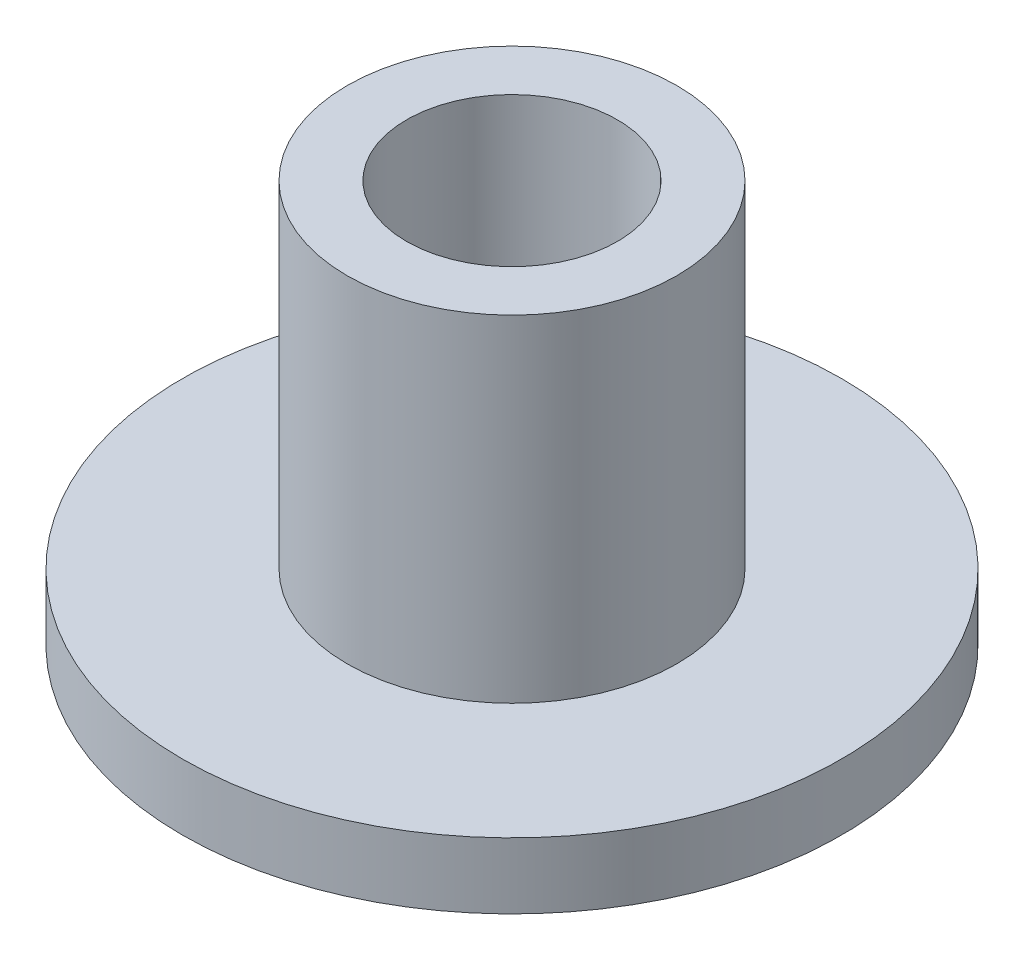
ISO-10303-21;
HEADER;
FILE_DESCRIPTION(('STEP AP214'),'2;1');
FILE_NAME('part.step','',(''),(''),'','','');
FILE_SCHEMA(('AUTOMOTIVE_DESIGN { 1 0 10303 214 1 1 1 1 }'));
ENDSEC;
DATA;
#1=APPLICATION_CONTEXT('core data for automotive mechanical design processes');
#2=APPLICATION_PROTOCOL_DEFINITION('international standard','automotive_design',2000,#1);
#3=PRODUCT_CONTEXT('',#1,'mechanical');
#4=PRODUCT('Part','Part','',(#3));
#5=PRODUCT_RELATED_PRODUCT_CATEGORY('part','',(#4));
#6=PRODUCT_DEFINITION_FORMATION('','',#4);
#7=PRODUCT_DEFINITION_CONTEXT('part definition',#1,'design');
#8=PRODUCT_DEFINITION('design','',#6,#7);
#9=PRODUCT_DEFINITION_SHAPE('','',#8);
#10=(LENGTH_UNIT() NAMED_UNIT(*) SI_UNIT(.MILLI.,.METRE.));
#11=(NAMED_UNIT(*) PLANE_ANGLE_UNIT() SI_UNIT($,.RADIAN.));
#12=(NAMED_UNIT(*) SI_UNIT($,.STERADIAN.) SOLID_ANGLE_UNIT());
#13=UNCERTAINTY_MEASURE_WITH_UNIT(LENGTH_MEASURE(1.E-05),#10,'distance_accuracy_value','');
#14=(GEOMETRIC_REPRESENTATION_CONTEXT(3) GLOBAL_UNCERTAINTY_ASSIGNED_CONTEXT((#13)) GLOBAL_UNIT_ASSIGNED_CONTEXT((#10,
#11,#12)) REPRESENTATION_CONTEXT('',''));
#15=CARTESIAN_POINT('',(0.,0.,0.));
#16=DIRECTION('',(0.,0.,1.));
#17=DIRECTION('',(1.,0.,0.));
#18=AXIS2_PLACEMENT_3D('',#15,#16,#17);
#19=CARTESIAN_POINT('',(0.,6.1,0.));
#20=DIRECTION('',(0.,-1.,0.));
#21=DIRECTION('',(0.,0.,-1.));
#22=AXIS2_PLACEMENT_3D('',#19,#20,#21);
#23=CYLINDRICAL_SURFACE('',#22,5.);
#24=CARTESIAN_POINT('',(0.,0.,0.));
#25=DIRECTION('',(0.,1.,0.));
#26=DIRECTION('',(0.,0.,1.));
#27=AXIS2_PLACEMENT_3D('',#24,#25,#26);
#28=CIRCLE('',#27,5.);
#29=CARTESIAN_POINT('',(0.,0.,5.));
#30=VERTEX_POINT('',#29);
#31=EDGE_CURVE('E10',#30,#30,#28,.T.);
#32=ORIENTED_EDGE('',*,*,#31,.T.);
#33=EDGE_LOOP('',(#32));
#34=FACE_BOUND('',#33,.T.);
#35=CARTESIAN_POINT('',(0.,1.,0.));
#36=DIRECTION('',(0.,1.,0.));
#37=DIRECTION('',(0.,0.,1.));
#38=AXIS2_PLACEMENT_3D('',#35,#36,#37);
#39=CIRCLE('',#38,5.);
#40=CARTESIAN_POINT('',(0.,1.,5.));
#41=VERTEX_POINT('',#40);
#42=EDGE_CURVE('E33',#41,#41,#39,.T.);
#43=ORIENTED_EDGE('',*,*,#42,.F.);
#44=EDGE_LOOP('',(#43));
#45=FACE_BOUND('',#44,.T.);
#46=ADVANCED_FACE('F30',(#34,#45),#23,.T.);
#47=CARTESIAN_POINT('',(0.,6.1,0.));
#48=DIRECTION('',(0.,1.,0.));
#49=DIRECTION('',(0.,0.,1.));
#50=AXIS2_PLACEMENT_3D('',#47,#48,#49);
#51=PLANE('',#50);
#52=CARTESIAN_POINT('',(0.,6.1,0.));
#53=DIRECTION('',(0.,1.,0.));
#54=DIRECTION('',(0.,0.,1.));
#55=AXIS2_PLACEMENT_3D('',#52,#53,#54);
#56=CIRCLE('',#55,1.6);
#57=CARTESIAN_POINT('',(0.,6.1,1.6));
#58=VERTEX_POINT('',#57);
#59=EDGE_CURVE('E41',#58,#58,#56,.T.);
#60=ORIENTED_EDGE('',*,*,#59,.F.);
#61=EDGE_LOOP('',(#60));
#62=FACE_BOUND('',#61,.T.);
#63=CARTESIAN_POINT('',(0.,6.1,0.));
#64=DIRECTION('',(0.,1.,0.));
#65=DIRECTION('',(0.,0.,1.));
#66=AXIS2_PLACEMENT_3D('',#63,#64,#65);
#67=CIRCLE('',#66,2.5);
#68=CARTESIAN_POINT('',(0.,6.1,2.5));
#69=VERTEX_POINT('',#68);
#70=EDGE_CURVE('E46',#69,#69,#67,.T.);
#71=ORIENTED_EDGE('',*,*,#70,.T.);
#72=EDGE_LOOP('',(#71));
#73=FACE_BOUND('',#72,.T.);
#74=ADVANCED_FACE('F59',(#62,#73),#51,.T.);
#75=CARTESIAN_POINT('',(0.,0.,0.));
#76=DIRECTION('',(0.,1.,0.));
#77=DIRECTION('',(0.,0.,1.));
#78=AXIS2_PLACEMENT_3D('',#75,#76,#77);
#79=PLANE('',#78);
#80=CARTESIAN_POINT('',(0.,0.,0.));
#81=DIRECTION('',(0.,1.,0.));
#82=DIRECTION('',(0.,0.,1.));
#83=AXIS2_PLACEMENT_3D('',#80,#81,#82);
#84=CIRCLE('',#83,1.6);
#85=CARTESIAN_POINT('',(0.,0.,1.6));
#86=VERTEX_POINT('',#85);
#87=EDGE_CURVE('E37',#86,#86,#84,.T.);
#88=ORIENTED_EDGE('',*,*,#87,.T.);
#89=EDGE_LOOP('',(#88));
#90=FACE_BOUND('',#89,.T.);
#91=ORIENTED_EDGE('',*,*,#31,.F.);
#92=EDGE_LOOP('',(#91));
#93=FACE_BOUND('',#92,.T.);
#94=ADVANCED_FACE('F63',(#90,#93),#79,.F.);
#95=CARTESIAN_POINT('',(0.,6.1,0.));
#96=DIRECTION('',(0.,1.,0.));
#97=DIRECTION('',(0.,0.,1.));
#98=AXIS2_PLACEMENT_3D('',#95,#96,#97);
#99=CYLINDRICAL_SURFACE('',#98,1.6);
#100=ORIENTED_EDGE('',*,*,#87,.F.);
#101=EDGE_LOOP('',(#100));
#102=FACE_BOUND('',#101,.T.);
#103=ORIENTED_EDGE('',*,*,#59,.T.);
#104=EDGE_LOOP('',(#103));
#105=FACE_BOUND('',#104,.T.);
#106=ADVANCED_FACE('F69',(#102,#105),#99,.F.);
#107=CARTESIAN_POINT('',(0.,1.,0.));
#108=DIRECTION('',(0.,1.,0.));
#109=DIRECTION('',(0.,0.,1.));
#110=AXIS2_PLACEMENT_3D('',#107,#108,#109);
#111=PLANE('',#110);
#112=CARTESIAN_POINT('',(0.,1.,0.));
#113=DIRECTION('',(0.,1.,0.));
#114=DIRECTION('',(0.,0.,1.));
#115=AXIS2_PLACEMENT_3D('',#112,#113,#114);
#116=CIRCLE('',#115,2.5);
#117=CARTESIAN_POINT('',(0.,1.,2.5));
#118=VERTEX_POINT('',#117);
#119=EDGE_CURVE('E49',#118,#118,#116,.T.);
#120=ORIENTED_EDGE('',*,*,#119,.F.);
#121=EDGE_LOOP('',(#120));
#122=FACE_BOUND('',#121,.T.);
#123=ORIENTED_EDGE('',*,*,#42,.T.);
#124=EDGE_LOOP('',(#123));
#125=FACE_BOUND('',#124,.T.);
#126=ADVANCED_FACE('F56',(#122,#125),#111,.T.);
#127=CARTESIAN_POINT('',(0.,1.,0.));
#128=DIRECTION('',(0.,1.,0.));
#129=DIRECTION('',(0.,0.,1.));
#130=AXIS2_PLACEMENT_3D('',#127,#128,#129);
#131=CYLINDRICAL_SURFACE('',#130,2.5);
#132=ORIENTED_EDGE('',*,*,#119,.T.);
#133=EDGE_LOOP('',(#132));
#134=FACE_BOUND('',#133,.T.);
#135=ORIENTED_EDGE('',*,*,#70,.F.);
#136=EDGE_LOOP('',(#135));
#137=FACE_BOUND('',#136,.T.);
#138=ADVANCED_FACE('F79',(#134,#137),#131,.T.);
#139=CLOSED_SHELL('',(#46,#74,#94,#106,#126,#138));
#140=MANIFOLD_SOLID_BREP('B2',#139);
#141=ADVANCED_BREP_SHAPE_REPRESENTATION('',(#18,#140),#14);
#142=SHAPE_DEFINITION_REPRESENTATION(#9,#141);
ENDSEC;
END-ISO-10303-21;
